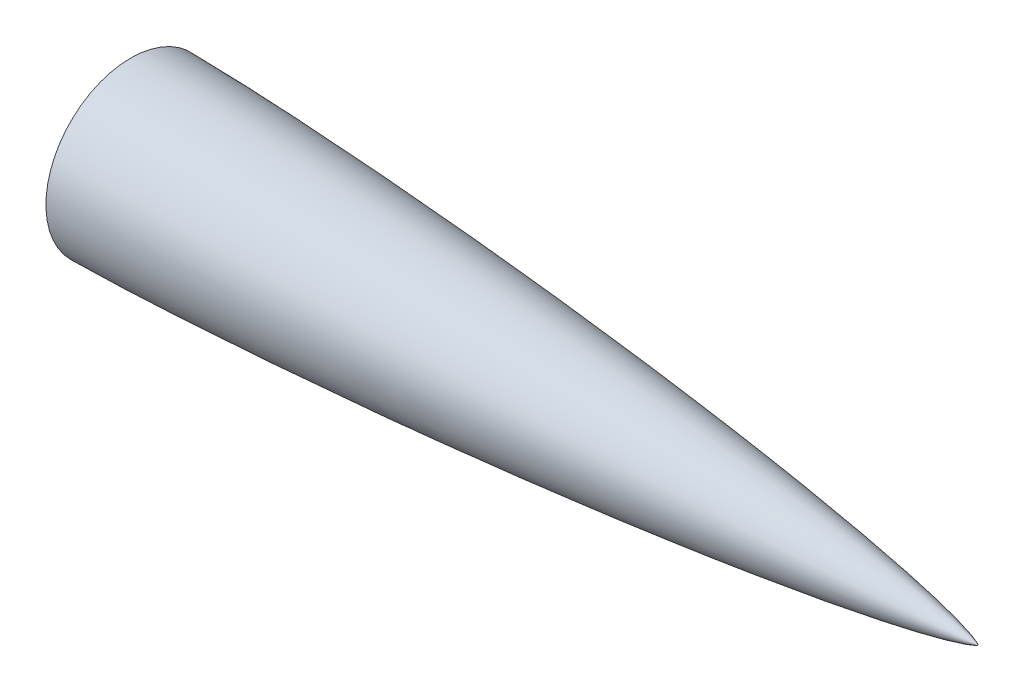
ISO-10303-21;
HEADER;
FILE_DESCRIPTION(('STEP AP214'),'2;1');
FILE_NAME('part.step','',(''),(''),'','','');
FILE_SCHEMA(('AUTOMOTIVE_DESIGN { 1 0 10303 214 1 1 1 1 }'));
ENDSEC;
DATA;
#1=APPLICATION_CONTEXT('core data for automotive mechanical design processes');
#2=APPLICATION_PROTOCOL_DEFINITION('international standard','automotive_design',2000,#1);
#3=PRODUCT_CONTEXT('',#1,'mechanical');
#4=PRODUCT('Part','Part','',(#3));
#5=PRODUCT_RELATED_PRODUCT_CATEGORY('part','',(#4));
#6=PRODUCT_DEFINITION_FORMATION('','',#4);
#7=PRODUCT_DEFINITION_CONTEXT('part definition',#1,'design');
#8=PRODUCT_DEFINITION('design','',#6,#7);
#9=PRODUCT_DEFINITION_SHAPE('','',#8);
#10=(LENGTH_UNIT() NAMED_UNIT(*) SI_UNIT(.MILLI.,.METRE.));
#11=(NAMED_UNIT(*) PLANE_ANGLE_UNIT() SI_UNIT($,.RADIAN.));
#12=(NAMED_UNIT(*) SI_UNIT($,.STERADIAN.) SOLID_ANGLE_UNIT());
#13=UNCERTAINTY_MEASURE_WITH_UNIT(LENGTH_MEASURE(1.E-05),#10,'distance_accuracy_value','');
#14=(GEOMETRIC_REPRESENTATION_CONTEXT(3) GLOBAL_UNCERTAINTY_ASSIGNED_CONTEXT((#13)) GLOBAL_UNIT_ASSIGNED_CONTEXT((#10,
#11,#12)) REPRESENTATION_CONTEXT('',''));
#15=CARTESIAN_POINT('',(0.,0.,0.));
#16=DIRECTION('',(0.,0.,1.));
#17=DIRECTION('',(1.,0.,0.));
#18=AXIS2_PLACEMENT_3D('',#15,#16,#17);
#19=CARTESIAN_POINT('',(500.,0.,0.));
#20=CARTESIAN_POINT('',(499.999855374078,0.00105667685288139,0.));
#21=CARTESIAN_POINT('',(499.999473149455,0.00314760141517102,0.));
#22=CARTESIAN_POINT('',(499.989884112919,0.027813593483842,0.));
#23=CARTESIAN_POINT('',(499.959516089831,0.0684284841642374,0.));
#24=CARTESIAN_POINT('',(499.8941111278,0.140909961058964,0.));
#25=CARTESIAN_POINT('',(499.678445856821,0.324546206700043,0.));
#26=CARTESIAN_POINT('',(499.330060205515,0.552429070323173,0.));
#27=CARTESIAN_POINT('',(498.699898098501,0.905298017220971,0.));
#28=CARTESIAN_POINT('',(497.703206303592,1.37977747380619,0.));
#29=CARTESIAN_POINT('',(496.46181374076,1.90224069672796,0.));
#30=CARTESIAN_POINT('',(494.313191943477,2.71731483567503,0.));
#31=CARTESIAN_POINT('',(491.39853534429,3.69923953859262,0.));
#32=CARTESIAN_POINT('',(487.470469287479,4.89704802180853,0.));
#33=CARTESIAN_POINT('',(482.519428310974,6.26951783860311,0.));
#34=CARTESIAN_POINT('',(475.787257881252,8.00046793384682,0.));
#35=CARTESIAN_POINT('',(468.497360792221,9.72258656199059,0.));
#36=CARTESIAN_POINT('',(461.002982952167,11.3855455147667,0.));
#37=CARTESIAN_POINT('',(451.696581810748,13.3440023621405,0.));
#38=CARTESIAN_POINT('',(442.006011586879,15.2856352390136,0.));
#39=CARTESIAN_POINT('',(430.679025094566,17.4417892835313,0.));
#40=CARTESIAN_POINT('',(413.901531965891,20.4760114243256,0.));
#41=CARTESIAN_POINT('',(393.275539874713,23.982925192402,0.));
#42=CARTESIAN_POINT('',(368.790445546465,27.8855778005157,0.));
#43=CARTESIAN_POINT('',(340.43890245292,32.1209803860387,0.));
#44=CARTESIAN_POINT('',(304.958453193657,37.1319743553146,0.));
#45=CARTESIAN_POINT('',(262.329144219325,42.7610396261634,0.));
#46=CARTESIAN_POINT('',(212.5367663826,48.8719105274048,0.));
#47=CARTESIAN_POINT('',(155.570188090166,55.3371061862386,0.));
#48=CARTESIAN_POINT('',(98.5543027241844,61.3506506088137,0.));
#49=CARTESIAN_POINT('',(41.496842523248,66.9551987229654,0.));
#50=CARTESIAN_POINT('',(-15.5967593337145,72.1779101764512,0.));
#51=CARTESIAN_POINT('',(-72.7226423842077,77.0343474198724,0.));
#52=CARTESIAN_POINT('',(-122.733590963946,80.9686806971154,0.));
#53=CARTESIAN_POINT('',(-165.617260353958,84.1142682240875,0.));
#54=CARTESIAN_POINT('',(-201.364603267943,86.5806407043358,0.));
#55=CARTESIAN_POINT('',(-229.968921229412,88.458500018746,0.));
#56=CARTESIAN_POINT('',(-258.579505395566,90.2380530440827,0.));
#57=CARTESIAN_POINT('',(-287.196258069299,91.9152107176591,0.));
#58=CARTESIAN_POINT('',(-315.819087177424,93.4846217560257,0.));
#59=CARTESIAN_POINT('',(-344.447947955899,94.9392424205052,0.));
#60=CARTESIAN_POINT('',(-369.503505798116,96.1033586252901,0.));
#61=CARTESIAN_POINT('',(-390.983496729196,97.0154586156068,0.));
#62=CARTESIAN_POINT('',(-408.886078409372,97.7125339978356,0.));
#63=CARTESIAN_POINT('',(-423.209733631157,98.2293996439461,0.));
#64=CARTESIAN_POINT('',(-437.408863694959,98.697574832933,0.));
#65=CARTESIAN_POINT('',(-449.755635126795,99.0623583176658,0.));
#66=CARTESIAN_POINT('',(-460.24946287927,99.3386138082513,0.));
#67=CARTESIAN_POINT('',(-468.88985712533,99.5409783474142,0.));
#68=CARTESIAN_POINT('',(-475.802544221384,99.686335298338,0.));
#69=CARTESIAN_POINT('',(-481.851472931039,99.7967001604281,0.));
#70=CARTESIAN_POINT('',(-487.03650510966,99.8777583638926,0.));
#71=CARTESIAN_POINT('',(-491.357523333725,99.9333083003815,0.));
#72=CARTESIAN_POINT('',(-494.814434067346,99.9712170026172,0.));
#73=CARTESIAN_POINT('',(-497.4071880108,99.9892814840706,0.));
#74=CARTESIAN_POINT('',(-499.135724285516,100.,0.));
#75=CARTESIAN_POINT('',(-500.,100.,0.));
#76=B_SPLINE_CURVE_WITH_KNOTS('',4,(#19,#20,#21,#22,#23,#24,#25,#26,#27,#28,#29,#30,#31,#32,#33,
#34,#35,#36,#37,#38,#39,#40,#41,#42,#43,#44,#45,#46,#47,#48,#49,#50,#51,#52,#53,#54,#55,#56,#57,
#58,#59,#60,#61,#62,#63,#64,#65,#66,#67,#68,#69,#70,#71,#72,#73,#74,#75),.UNSPECIFIED.,.F.,.F.,
(5,1,1,1,1,1,1,1,1,1,1,1,1,1,1,1,1,1,1,1,1,1,1,1,1,1,1,1,1,1,1,1,1,1,1,1,1,1,1,1,1,1,1,1,1,1,1,
1,1,1,1,1,1,5),(0.,4.22838733689323E-06,8.45677467378646E-06,0.000104248553634767,
0.000200040332595747,0.000391623890517708,0.00113129947330439,0.00175484322036961,
0.00306816456098918,0.00477479996506832,0.00648143536914747,0.0108834511256165,
0.0152854668820856,0.0210891295134596,0.0268927921448336,0.0385001174075817,0.0450445697763869,
0.0515890221451922,0.0646779268828028,0.0777668316204133,0.0908557363580239,0.119329113177378,
0.147802489996732,0.176275912086524,0.204749334176316,0.261696060498728,0.318642867796282,
0.37558975687019,0.43253652814802,0.489483297638752,0.546430088563643,0.603376880422206,
0.660323574290478,0.688797052897429,0.717270531504379,0.745743931208582,0.774217330912784,
0.802690722109486,0.831164113306188,0.859637344698432,0.888110576090677,0.902347333677297,
0.916584091263918,0.930820848850538,0.945057606437158,0.958793204827869,0.965661004023224,
0.972528803218579,0.979396602413934,0.98626440160929,0.989698301206967,0.993132200804645,
0.996566100402322,1.),.UNSPECIFIED.);
#77=CARTESIAN_POINT('',(500.,0.,0.));
#78=DIRECTION('',(1.,0.,0.));
#79=AXIS1_PLACEMENT('',#77,#78);
#80=SURFACE_OF_REVOLUTION('',#76,#79);
#81=CARTESIAN_POINT('',(-500.,0.,0.));
#82=DIRECTION('',(1.,0.,0.));
#83=DIRECTION('',(0.,0.,-1.));
#84=AXIS2_PLACEMENT_3D('',#81,#82,#83);
#85=CIRCLE('',#84,100.);
#86=CARTESIAN_POINT('',(-500.,0.,-100.));
#87=VERTEX_POINT('',#86);
#88=EDGE_CURVE('E11',#87,#87,#85,.T.);
#89=ORIENTED_EDGE('',*,*,#88,.T.);
#90=EDGE_LOOP('',(#89));
#91=FACE_BOUND('',#90,.T.);
#92=CARTESIAN_POINT('',(500.,0.,0.));
#93=VERTEX_POINT('',#92);
#94=VERTEX_LOOP('',#93);
#95=FACE_BOUND('',#94,.T.);
#96=ADVANCED_FACE('F33',(#91,#95),#80,.F.);
#97=CARTESIAN_POINT('',(-500.,100.,0.));
#98=DIRECTION('',(-1.,0.,0.));
#99=DIRECTION('',(0.,0.,1.));
#100=AXIS2_PLACEMENT_3D('',#97,#98,#99);
#101=PLANE('',#100);
#102=ORIENTED_EDGE('',*,*,#88,.F.);
#103=EDGE_LOOP('',(#102));
#104=FACE_BOUND('',#103,.T.);
#105=ADVANCED_FACE('F42',(#104),#101,.T.);
#106=CLOSED_SHELL('',(#96,#105));
#107=MANIFOLD_SOLID_BREP('B2',#106);
#108=ADVANCED_BREP_SHAPE_REPRESENTATION('',(#18,#107),#14);
#109=SHAPE_DEFINITION_REPRESENTATION(#9,#108);
ENDSEC;
END-ISO-10303-21;
